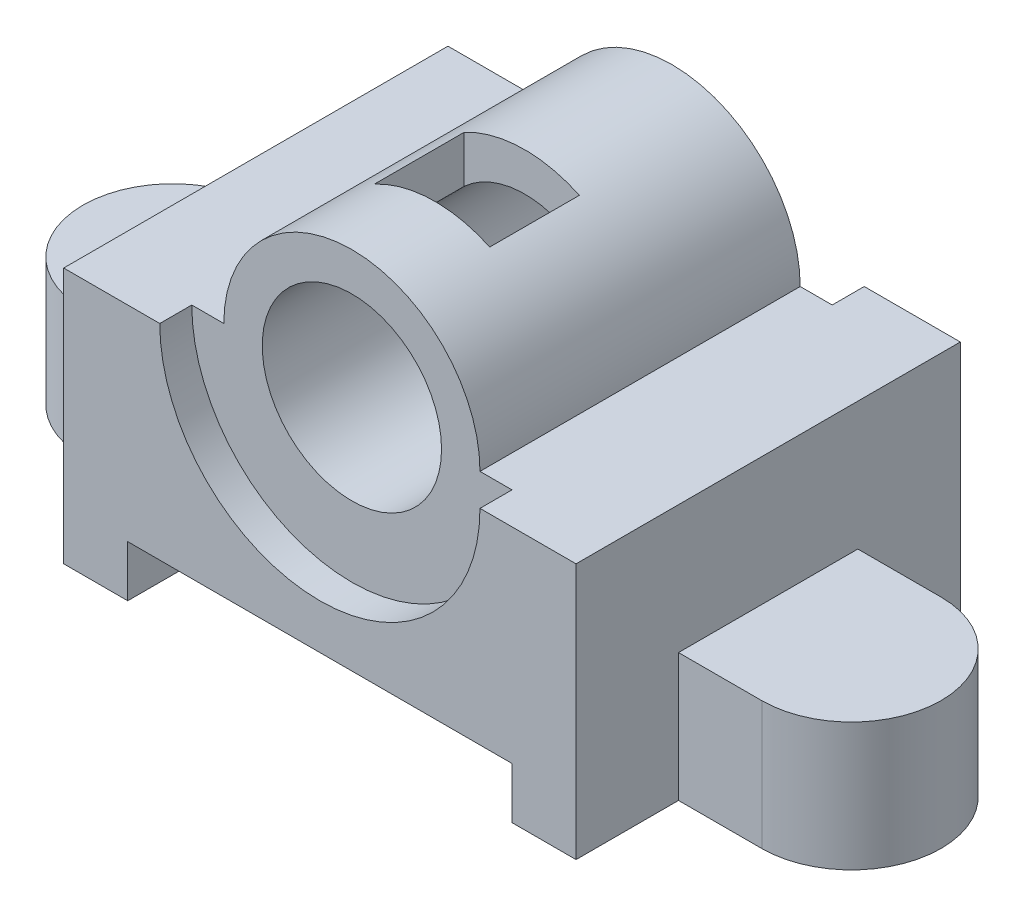
ISO-10303-21;
HEADER;
FILE_DESCRIPTION(('STEP AP214'),'2;1');
FILE_NAME('part.step','',(''),(''),'','','');
FILE_SCHEMA(('AUTOMOTIVE_DESIGN { 1 0 10303 214 1 1 1 1 }'));
ENDSEC;
DATA;
#1=APPLICATION_CONTEXT('core data for automotive mechanical design processes');
#2=APPLICATION_PROTOCOL_DEFINITION('international standard','automotive_design',2000,#1);
#3=PRODUCT_CONTEXT('',#1,'mechanical');
#4=PRODUCT('Part','Part','',(#3));
#5=PRODUCT_RELATED_PRODUCT_CATEGORY('part','',(#4));
#6=PRODUCT_DEFINITION_FORMATION('','',#4);
#7=PRODUCT_DEFINITION_CONTEXT('part definition',#1,'design');
#8=PRODUCT_DEFINITION('design','',#6,#7);
#9=PRODUCT_DEFINITION_SHAPE('','',#8);
#10=(LENGTH_UNIT() NAMED_UNIT(*) SI_UNIT(.MILLI.,.METRE.));
#11=(NAMED_UNIT(*) PLANE_ANGLE_UNIT() SI_UNIT($,.RADIAN.));
#12=(NAMED_UNIT(*) SI_UNIT($,.STERADIAN.) SOLID_ANGLE_UNIT());
#13=UNCERTAINTY_MEASURE_WITH_UNIT(LENGTH_MEASURE(1.E-05),#10,'distance_accuracy_value','');
#14=(GEOMETRIC_REPRESENTATION_CONTEXT(3) GLOBAL_UNCERTAINTY_ASSIGNED_CONTEXT((#13)) GLOBAL_UNIT_ASSIGNED_CONTEXT((#10,
#11,#12)) REPRESENTATION_CONTEXT('',''));
#15=CARTESIAN_POINT('',(0.,0.,0.));
#16=DIRECTION('',(0.,0.,1.));
#17=DIRECTION('',(1.,0.,0.));
#18=AXIS2_PLACEMENT_3D('',#15,#16,#17);
#19=CARTESIAN_POINT('',(37.2643253234751,0.,-60.));
#20=DIRECTION('',(1.,0.,0.));
#21=DIRECTION('',(0.,0.,-1.));
#22=AXIS2_PLACEMENT_3D('',#19,#20,#21);
#23=PLANE('',#22);
#24=DIRECTION('',(0.,-1.,0.));
#25=VECTOR('',#24,1.);
#26=CARTESIAN_POINT('',(37.264325323475,20.,-44.));
#27=LINE('',#26,#25);
#28=CARTESIAN_POINT('',(37.2643253234751,20.0000000000001,-44.));
#29=VERTEX_POINT('',#28);
#30=CARTESIAN_POINT('',(37.2643253234751,0.,-44.));
#31=VERTEX_POINT('',#30);
#32=EDGE_CURVE('E210',#29,#31,#27,.T.);
#33=ORIENTED_EDGE('',*,*,#32,.T.);
#34=DIRECTION('',(0.,0.,1.));
#35=VECTOR('',#34,1.);
#36=CARTESIAN_POINT('',(37.2643253234751,0.,-60.));
#37=LINE('',#36,#35);
#38=CARTESIAN_POINT('',(37.2643253234751,0.,-60.));
#39=VERTEX_POINT('',#38);
#40=EDGE_CURVE('E214',#39,#31,#37,.T.);
#41=ORIENTED_EDGE('',*,*,#40,.F.);
#42=DIRECTION('',(0.,1.,0.));
#43=VECTOR('',#42,1.);
#44=CARTESIAN_POINT('',(37.2643253234751,0.,-60.));
#45=LINE('',#44,#43);
#46=CARTESIAN_POINT('',(37.2643253234751,40.,-60.));
#47=VERTEX_POINT('',#46);
#48=EDGE_CURVE('E371',#39,#47,#45,.T.);
#49=ORIENTED_EDGE('',*,*,#48,.T.);
#50=DIRECTION('',(0.,0.,1.));
#51=VECTOR('',#50,1.);
#52=CARTESIAN_POINT('',(37.2643253234751,40.,-60.));
#53=LINE('',#52,#51);
#54=CARTESIAN_POINT('',(37.2643253234751,40.,0.));
#55=VERTEX_POINT('',#54);
#56=EDGE_CURVE('E234',#47,#55,#53,.T.);
#57=ORIENTED_EDGE('',*,*,#56,.T.);
#58=DIRECTION('',(0.,1.,0.));
#59=VECTOR('',#58,1.);
#60=CARTESIAN_POINT('',(37.2643253234751,0.,0.));
#61=LINE('',#60,#59);
#62=CARTESIAN_POINT('',(37.2643253234751,0.,0.));
#63=VERTEX_POINT('',#62);
#64=EDGE_CURVE('E383',#63,#55,#61,.T.);
#65=ORIENTED_EDGE('',*,*,#64,.F.);
#66=CARTESIAN_POINT('',(37.2643253234751,0.,-16.));
#67=VERTEX_POINT('',#66);
#68=EDGE_CURVE('E235',#67,#63,#37,.T.);
#69=ORIENTED_EDGE('',*,*,#68,.F.);
#70=DIRECTION('',(0.,-1.,0.));
#71=VECTOR('',#70,1.);
#72=CARTESIAN_POINT('',(37.264325323475,20.,-16.));
#73=LINE('',#72,#71);
#74=CARTESIAN_POINT('',(37.2643253234751,20.0000000000001,-16.));
#75=VERTEX_POINT('',#74);
#76=EDGE_CURVE('E54',#75,#67,#73,.T.);
#77=ORIENTED_EDGE('',*,*,#76,.F.);
#78=DIRECTION('',(0.,0.,1.));
#79=VECTOR('',#78,1.);
#80=CARTESIAN_POINT('',(37.264325323475,20.,0.));
#81=LINE('',#80,#79);
#82=EDGE_CURVE('E59',#29,#75,#81,.T.);
#83=ORIENTED_EDGE('',*,*,#82,.F.);
#84=EDGE_LOOP('',(#33,#41,#49,#57,#65,#69,#77,#83));
#85=FACE_BOUND('',#84,.T.);
#86=ADVANCED_FACE('F39',(#85),#23,.T.);
#87=CARTESIAN_POINT('',(-42.735674676525,40.,-60.));
#88=DIRECTION('',(-1.,0.,0.));
#89=DIRECTION('',(0.,-1.,0.));
#90=AXIS2_PLACEMENT_3D('',#87,#88,#89);
#91=PLANE('',#90);
#92=DIRECTION('',(0.,-1.,0.));
#93=VECTOR('',#92,1.);
#94=CARTESIAN_POINT('',(-42.735674676525,20.,-16.));
#95=LINE('',#94,#93);
#96=CARTESIAN_POINT('',(-42.735674676525,20.,-16.));
#97=VERTEX_POINT('',#96);
#98=CARTESIAN_POINT('',(-42.735674676525,0.,-16.));
#99=VERTEX_POINT('',#98);
#100=EDGE_CURVE('E294',#97,#99,#95,.T.);
#101=ORIENTED_EDGE('',*,*,#100,.T.);
#102=DIRECTION('',(0.,0.,1.));
#103=VECTOR('',#102,1.);
#104=CARTESIAN_POINT('',(-42.735674676525,0.,-60.));
#105=LINE('',#104,#103);
#106=CARTESIAN_POINT('',(-42.735674676525,0.,0.));
#107=VERTEX_POINT('',#106);
#108=EDGE_CURVE('E244',#99,#107,#105,.T.);
#109=ORIENTED_EDGE('',*,*,#108,.T.);
#110=DIRECTION('',(0.,-1.,0.));
#111=VECTOR('',#110,1.);
#112=CARTESIAN_POINT('',(-42.735674676525,40.,0.));
#113=LINE('',#112,#111);
#114=CARTESIAN_POINT('',(-42.735674676525,40.,0.));
#115=VERTEX_POINT('',#114);
#116=EDGE_CURVE('E358',#115,#107,#113,.T.);
#117=ORIENTED_EDGE('',*,*,#116,.F.);
#118=DIRECTION('',(0.,0.,1.));
#119=VECTOR('',#118,1.);
#120=CARTESIAN_POINT('',(-42.735674676525,40.,-60.));
#121=LINE('',#120,#119);
#122=CARTESIAN_POINT('',(-42.735674676525,40.,-60.));
#123=VERTEX_POINT('',#122);
#124=EDGE_CURVE('E237',#123,#115,#121,.T.);
#125=ORIENTED_EDGE('',*,*,#124,.F.);
#126=DIRECTION('',(0.,-1.,0.));
#127=VECTOR('',#126,1.);
#128=CARTESIAN_POINT('',(-42.735674676525,40.,-60.));
#129=LINE('',#128,#127);
#130=CARTESIAN_POINT('',(-42.735674676525,0.,-60.));
#131=VERTEX_POINT('',#130);
#132=EDGE_CURVE('E364',#123,#131,#129,.T.);
#133=ORIENTED_EDGE('',*,*,#132,.T.);
#134=CARTESIAN_POINT('',(-42.735674676525,0.,-44.));
#135=VERTEX_POINT('',#134);
#136=EDGE_CURVE('E239',#131,#135,#105,.T.);
#137=ORIENTED_EDGE('',*,*,#136,.T.);
#138=DIRECTION('',(0.,-1.,0.));
#139=VECTOR('',#138,1.);
#140=CARTESIAN_POINT('',(-42.735674676525,20.,-44.));
#141=LINE('',#140,#139);
#142=CARTESIAN_POINT('',(-42.735674676525,20.,-44.));
#143=VERTEX_POINT('',#142);
#144=EDGE_CURVE('E453',#143,#135,#141,.T.);
#145=ORIENTED_EDGE('',*,*,#144,.F.);
#146=DIRECTION('',(0.,0.,-1.));
#147=VECTOR('',#146,1.);
#148=CARTESIAN_POINT('',(-42.735674676525,20.,0.));
#149=LINE('',#148,#147);
#150=EDGE_CURVE('E454',#97,#143,#149,.T.);
#151=ORIENTED_EDGE('',*,*,#150,.F.);
#152=EDGE_LOOP('',(#101,#109,#117,#125,#133,#137,#145,#151));
#153=FACE_BOUND('',#152,.T.);
#154=ADVANCED_FACE('F41',(#153),#91,.T.);
#155=CARTESIAN_POINT('',(-2.73567467652495,40.,-55.));
#156=DIRECTION('',(0.,0.,1.));
#157=DIRECTION('',(1.,0.,0.));
#158=AXIS2_PLACEMENT_3D('',#155,#156,#157);
#159=CYLINDRICAL_SURFACE('',#158,20.);
#160=CARTESIAN_POINT('',(-2.73567467652495,40.,-55.));
#161=DIRECTION('',(0.,0.,1.));
#162=DIRECTION('',(1.,0.,0.));
#163=AXIS2_PLACEMENT_3D('',#160,#161,#162);
#164=CIRCLE('',#163,20.);
#165=CARTESIAN_POINT('',(17.264325323475,40.,-55.));
#166=VERTEX_POINT('',#165);
#167=CARTESIAN_POINT('',(-22.735674676525,40.,-55.));
#168=VERTEX_POINT('',#167);
#169=EDGE_CURVE('E310',#166,#168,#164,.T.);
#170=ORIENTED_EDGE('',*,*,#169,.T.);
#171=DIRECTION('',(0.,0.,1.));
#172=VECTOR('',#171,1.);
#173=CARTESIAN_POINT('',(-22.735674676525,40.,-55.));
#174=LINE('',#173,#172);
#175=CARTESIAN_POINT('',(-22.735674676525,40.,-5.));
#176=VERTEX_POINT('',#175);
#177=EDGE_CURVE('E318',#168,#176,#174,.T.);
#178=ORIENTED_EDGE('',*,*,#177,.T.);
#179=CARTESIAN_POINT('',(-2.73567467652495,40.,-5.));
#180=DIRECTION('',(0.,0.,1.));
#181=DIRECTION('',(1.,0.,0.));
#182=AXIS2_PLACEMENT_3D('',#179,#180,#181);
#183=CIRCLE('',#182,20.);
#184=CARTESIAN_POINT('',(17.264325323475,40.,-5.));
#185=VERTEX_POINT('',#184);
#186=EDGE_CURVE('E307',#185,#176,#183,.T.);
#187=ORIENTED_EDGE('',*,*,#186,.F.);
#188=DIRECTION('',(0.,0.,1.));
#189=VECTOR('',#188,1.);
#190=CARTESIAN_POINT('',(17.264325323475,40.,-55.));
#191=LINE('',#190,#189);
#192=EDGE_CURVE('E313',#185,#166,#191,.F.);
#193=ORIENTED_EDGE('',*,*,#192,.T.);
#194=EDGE_LOOP('',(#170,#178,#187,#193));
#195=FACE_BOUND('',#194,.T.);
#196=CARTESIAN_POINT('',(-2.73567467652495,40.,-18.));
#197=DIRECTION('',(0.,0.,-1.));
#198=DIRECTION('',(-1.,0.,0.));
#199=AXIS2_PLACEMENT_3D('',#196,#197,#198);
#200=CIRCLE('',#199,20.);
#201=CARTESIAN_POINT('',(5.78508231148436,58.094106785119,-18.));
#202=VERTEX_POINT('',#201);
#203=CARTESIAN_POINT('',(-12.2138200901533,57.6114950960478,-18.));
#204=VERTEX_POINT('',#203);
#205=EDGE_CURVE('E300',#202,#204,#200,.F.);
#206=ORIENTED_EDGE('',*,*,#205,.T.);
#207=DIRECTION('',(0.,0.,1.));
#208=VECTOR('',#207,1.);
#209=CARTESIAN_POINT('',(-12.2138200901533,57.6114950960478,-55.));
#210=LINE('',#209,#208);
#211=CARTESIAN_POINT('',(-12.2138200901533,57.6114950960478,-32.));
#212=VERTEX_POINT('',#211);
#213=EDGE_CURVE('E277',#204,#212,#210,.F.);
#214=ORIENTED_EDGE('',*,*,#213,.T.);
#215=CARTESIAN_POINT('',(-2.73567467652495,40.,-32.));
#216=DIRECTION('',(0.,0.,1.));
#217=DIRECTION('',(1.,0.,0.));
#218=AXIS2_PLACEMENT_3D('',#215,#216,#217);
#219=CIRCLE('',#218,20.);
#220=CARTESIAN_POINT('',(5.78508231148436,58.094106785119,-32.));
#221=VERTEX_POINT('',#220);
#222=EDGE_CURVE('E278',#212,#221,#219,.F.);
#223=ORIENTED_EDGE('',*,*,#222,.T.);
#224=DIRECTION('',(0.,0.,1.));
#225=VECTOR('',#224,1.);
#226=CARTESIAN_POINT('',(5.78508231148436,58.094106785119,-55.));
#227=LINE('',#226,#225);
#228=EDGE_CURVE('E290',#221,#202,#227,.T.);
#229=ORIENTED_EDGE('',*,*,#228,.T.);
#230=EDGE_LOOP('',(#206,#214,#223,#229));
#231=FACE_BOUND('',#230,.T.);
#232=ADVANCED_FACE('F418',(#195,#231),#159,.T.);
#233=CARTESIAN_POINT('',(-2.73567467652495,40.,-55.));
#234=DIRECTION('',(0.,0.,1.));
#235=DIRECTION('',(1.,0.,0.));
#236=AXIS2_PLACEMENT_3D('',#233,#234,#235);
#237=CYLINDRICAL_SURFACE('',#236,14.);
#238=CARTESIAN_POINT('',(-2.73567467652495,40.,-5.));
#239=DIRECTION('',(0.,0.,1.));
#240=DIRECTION('',(1.,0.,0.));
#241=AXIS2_PLACEMENT_3D('',#238,#239,#240);
#242=CIRCLE('',#241,14.);
#243=CARTESIAN_POINT('',(11.264325323475,40.,-5.));
#244=VERTEX_POINT('',#243);
#245=EDGE_CURVE('E303',#244,#244,#242,.T.);
#246=ORIENTED_EDGE('',*,*,#245,.T.);
#247=EDGE_LOOP('',(#246));
#248=FACE_BOUND('',#247,.T.);
#249=CARTESIAN_POINT('',(-2.73567467652495,40.,-55.));
#250=DIRECTION('',(0.,0.,1.));
#251=DIRECTION('',(1.,0.,0.));
#252=AXIS2_PLACEMENT_3D('',#249,#250,#251);
#253=CIRCLE('',#252,14.);
#254=CARTESIAN_POINT('',(11.264325323475,40.,-55.));
#255=VERTEX_POINT('',#254);
#256=EDGE_CURVE('E304',#255,#255,#253,.T.);
#257=ORIENTED_EDGE('',*,*,#256,.F.);
#258=EDGE_LOOP('',(#257));
#259=FACE_BOUND('',#258,.T.);
#260=DIRECTION('',(0.,0.,1.));
#261=VECTOR('',#260,1.);
#262=CARTESIAN_POINT('',(-12.2138200901533,50.3036284637071,-55.));
#263=LINE('',#262,#261);
#264=CARTESIAN_POINT('',(-12.2138200901533,50.3036284637071,-18.));
#265=VERTEX_POINT('',#264);
#266=CARTESIAN_POINT('',(-12.2138200901533,50.3036284637071,-32.));
#267=VERTEX_POINT('',#266);
#268=EDGE_CURVE('E11',#265,#267,#263,.F.);
#269=ORIENTED_EDGE('',*,*,#268,.F.);
#270=CARTESIAN_POINT('',(-2.73567467652495,40.,-18.));
#271=DIRECTION('',(0.,0.,-1.));
#272=DIRECTION('',(-1.,0.,0.));
#273=AXIS2_PLACEMENT_3D('',#270,#271,#272);
#274=CIRCLE('',#273,14.);
#275=CARTESIAN_POINT('',(5.78508231148436,51.1084067422511,-18.));
#276=VERTEX_POINT('',#275);
#277=EDGE_CURVE('E47',#276,#265,#274,.F.);
#278=ORIENTED_EDGE('',*,*,#277,.F.);
#279=DIRECTION('',(0.,0.,1.));
#280=VECTOR('',#279,1.);
#281=CARTESIAN_POINT('',(5.78508231148436,51.1084067422511,-55.));
#282=LINE('',#281,#280);
#283=CARTESIAN_POINT('',(5.78508231148436,51.1084067422511,-32.));
#284=VERTEX_POINT('',#283);
#285=EDGE_CURVE('E258',#284,#276,#282,.T.);
#286=ORIENTED_EDGE('',*,*,#285,.F.);
#287=CARTESIAN_POINT('',(-2.73567467652495,40.,-32.));
#288=DIRECTION('',(0.,0.,1.));
#289=DIRECTION('',(1.,0.,0.));
#290=AXIS2_PLACEMENT_3D('',#287,#288,#289);
#291=CIRCLE('',#290,14.);
#292=EDGE_CURVE('E256',#267,#284,#291,.F.);
#293=ORIENTED_EDGE('',*,*,#292,.F.);
#294=EDGE_LOOP('',(#269,#278,#286,#293));
#295=FACE_BOUND('',#294,.T.);
#296=ADVANCED_FACE('F280',(#248,#259,#295),#237,.F.);
#297=CARTESIAN_POINT('',(37.2643253234751,40.,-60.));
#298=DIRECTION('',(0.,1.,0.));
#299=DIRECTION('',(-1.,0.,0.));
#300=AXIS2_PLACEMENT_3D('',#297,#298,#299);
#301=PLANE('',#300);
#302=ORIENTED_EDGE('',*,*,#177,.F.);
#303=DIRECTION('',(-1.,0.,0.));
#304=VECTOR('',#303,1.);
#305=CARTESIAN_POINT('',(37.2643253234751,40.,-55.));
#306=LINE('',#305,#304);
#307=CARTESIAN_POINT('',(-27.735674676525,40.,-55.));
#308=VERTEX_POINT('',#307);
#309=EDGE_CURVE('E253',#168,#308,#306,.T.);
#310=ORIENTED_EDGE('',*,*,#309,.T.);
#311=DIRECTION('',(0.,0.,-1.));
#312=VECTOR('',#311,1.);
#313=CARTESIAN_POINT('',(-27.735674676525,40.,-55.));
#314=LINE('',#313,#312);
#315=CARTESIAN_POINT('',(-27.735674676525,40.,-60.));
#316=VERTEX_POINT('',#315);
#317=EDGE_CURVE('E324',#316,#308,#314,.F.);
#318=ORIENTED_EDGE('',*,*,#317,.F.);
#319=DIRECTION('',(-1.,0.,0.));
#320=VECTOR('',#319,1.);
#321=CARTESIAN_POINT('',(37.2643253234751,40.,-60.));
#322=LINE('',#321,#320);
#323=EDGE_CURVE('E373',#316,#123,#322,.T.);
#324=ORIENTED_EDGE('',*,*,#323,.T.);
#325=ORIENTED_EDGE('',*,*,#124,.T.);
#326=DIRECTION('',(-1.,0.,0.));
#327=VECTOR('',#326,1.);
#328=CARTESIAN_POINT('',(37.2643253234751,40.,0.));
#329=LINE('',#328,#327);
#330=CARTESIAN_POINT('',(-27.735674676525,40.,0.));
#331=VERTEX_POINT('',#330);
#332=EDGE_CURVE('E386',#331,#115,#329,.T.);
#333=ORIENTED_EDGE('',*,*,#332,.F.);
#334=DIRECTION('',(0.,0.,1.));
#335=VECTOR('',#334,1.);
#336=CARTESIAN_POINT('',(-27.735674676525,40.,-5.));
#337=LINE('',#336,#335);
#338=CARTESIAN_POINT('',(-27.735674676525,40.,-5.));
#339=VERTEX_POINT('',#338);
#340=EDGE_CURVE('E335',#339,#331,#337,.T.);
#341=ORIENTED_EDGE('',*,*,#340,.F.);
#342=DIRECTION('',(1.,0.,0.));
#343=VECTOR('',#342,1.);
#344=CARTESIAN_POINT('',(37.2643253234751,40.,-5.));
#345=LINE('',#344,#343);
#346=EDGE_CURVE('E248',#339,#176,#345,.T.);
#347=ORIENTED_EDGE('',*,*,#346,.T.);
#348=EDGE_LOOP('',(#302,#310,#318,#324,#325,#333,#341,#347));
#349=FACE_BOUND('',#348,.T.);
#350=ADVANCED_FACE('F393',(#349),#301,.T.);
#351=CARTESIAN_POINT('',(-42.735674676525,0.,-60.));
#352=DIRECTION('',(0.,-1.,0.));
#353=DIRECTION('',(0.,0.,-1.));
#354=AXIS2_PLACEMENT_3D('',#351,#352,#353);
#355=PLANE('',#354);
#356=DIRECTION('',(0.,0.,1.));
#357=VECTOR('',#356,1.);
#358=CARTESIAN_POINT('',(-32.735674676525,0.,-60.));
#359=LINE('',#358,#357);
#360=CARTESIAN_POINT('',(-32.735674676525,0.,-60.));
#361=VERTEX_POINT('',#360);
#362=CARTESIAN_POINT('',(-32.735674676525,0.,0.));
#363=VERTEX_POINT('',#362);
#364=EDGE_CURVE('E355',#361,#363,#359,.T.);
#365=ORIENTED_EDGE('',*,*,#364,.T.);
#366=DIRECTION('',(1.,0.,0.));
#367=VECTOR('',#366,1.);
#368=CARTESIAN_POINT('',(-42.735674676525,0.,0.));
#369=LINE('',#368,#367);
#370=EDGE_CURVE('E380',#107,#363,#369,.T.);
#371=ORIENTED_EDGE('',*,*,#370,.F.);
#372=ORIENTED_EDGE('',*,*,#108,.F.);
#373=DIRECTION('',(1.,0.,0.));
#374=VECTOR('',#373,1.);
#375=CARTESIAN_POINT('',(0.,0.,-16.));
#376=LINE('',#375,#374);
#377=CARTESIAN_POINT('',(-55.735674676525,0.,-16.));
#378=VERTEX_POINT('',#377);
#379=EDGE_CURVE('E490',#378,#99,#376,.T.);
#380=ORIENTED_EDGE('',*,*,#379,.F.);
#381=CARTESIAN_POINT('',(-55.735674676525,0.,-30.));
#382=DIRECTION('',(0.,-1.,0.));
#383=DIRECTION('',(1.,0.,0.));
#384=AXIS2_PLACEMENT_3D('',#381,#382,#383);
#385=CIRCLE('',#384,14.);
#386=CARTESIAN_POINT('',(-55.735674676525,0.,-44.));
#387=VERTEX_POINT('',#386);
#388=EDGE_CURVE('E487',#387,#378,#385,.F.);
#389=ORIENTED_EDGE('',*,*,#388,.F.);
#390=DIRECTION('',(-1.,0.,0.));
#391=VECTOR('',#390,1.);
#392=CARTESIAN_POINT('',(0.,0.,-44.));
#393=LINE('',#392,#391);
#394=EDGE_CURVE('E450',#135,#387,#393,.T.);
#395=ORIENTED_EDGE('',*,*,#394,.F.);
#396=ORIENTED_EDGE('',*,*,#136,.F.);
#397=DIRECTION('',(1.,0.,0.));
#398=VECTOR('',#397,1.);
#399=CARTESIAN_POINT('',(-42.735674676525,0.,-60.));
#400=LINE('',#399,#398);
#401=EDGE_CURVE('E368',#131,#361,#400,.T.);
#402=ORIENTED_EDGE('',*,*,#401,.T.);
#403=EDGE_LOOP('',(#365,#371,#372,#380,#389,#395,#396,#402));
#404=FACE_BOUND('',#403,.T.);
#405=ADVANCED_FACE('F446',(#404),#355,.T.);
#406=ORIENTED_EDGE('',*,*,#192,.F.);
#407=CARTESIAN_POINT('',(22.264325323475,40.,-5.));
#408=VERTEX_POINT('',#407);
#409=EDGE_CURVE('E247',#185,#408,#345,.T.);
#410=ORIENTED_EDGE('',*,*,#409,.T.);
#411=DIRECTION('',(0.,0.,1.));
#412=VECTOR('',#411,1.);
#413=CARTESIAN_POINT('',(22.264325323475,40.,-5.));
#414=LINE('',#413,#412);
#415=CARTESIAN_POINT('',(22.264325323475,40.,0.));
#416=VERTEX_POINT('',#415);
#417=EDGE_CURVE('E332',#416,#408,#414,.F.);
#418=ORIENTED_EDGE('',*,*,#417,.F.);
#419=EDGE_CURVE('E367',#55,#416,#329,.T.);
#420=ORIENTED_EDGE('',*,*,#419,.F.);
#421=ORIENTED_EDGE('',*,*,#56,.F.);
#422=CARTESIAN_POINT('',(22.264325323475,40.,-60.));
#423=VERTEX_POINT('',#422);
#424=EDGE_CURVE('E374',#47,#423,#322,.T.);
#425=ORIENTED_EDGE('',*,*,#424,.T.);
#426=DIRECTION('',(0.,0.,-1.));
#427=VECTOR('',#426,1.);
#428=CARTESIAN_POINT('',(22.264325323475,40.,-55.));
#429=LINE('',#428,#427);
#430=CARTESIAN_POINT('',(22.264325323475,40.,-55.));
#431=VERTEX_POINT('',#430);
#432=EDGE_CURVE('E327',#431,#423,#429,.T.);
#433=ORIENTED_EDGE('',*,*,#432,.F.);
#434=EDGE_CURVE('E254',#431,#166,#306,.T.);
#435=ORIENTED_EDGE('',*,*,#434,.T.);
#436=EDGE_LOOP('',(#406,#410,#418,#420,#421,#425,#433,#435));
#437=FACE_BOUND('',#436,.T.);
#438=ADVANCED_FACE('F412',(#437),#301,.T.);
#439=DIRECTION('',(0.,0.,1.));
#440=VECTOR('',#439,1.);
#441=CARTESIAN_POINT('',(27.2643253234751,0.,-60.));
#442=LINE('',#441,#440);
#443=CARTESIAN_POINT('',(27.2643253234751,0.,-60.));
#444=VERTEX_POINT('',#443);
#445=CARTESIAN_POINT('',(27.2643253234751,0.,0.));
#446=VERTEX_POINT('',#445);
#447=EDGE_CURVE('E348',#444,#446,#442,.T.);
#448=ORIENTED_EDGE('',*,*,#447,.F.);
#449=EDGE_CURVE('E233',#444,#39,#400,.T.);
#450=ORIENTED_EDGE('',*,*,#449,.T.);
#451=ORIENTED_EDGE('',*,*,#40,.T.);
#452=DIRECTION('',(-1.,0.,0.));
#453=VECTOR('',#452,1.);
#454=CARTESIAN_POINT('',(0.,0.,-44.));
#455=LINE('',#454,#453);
#456=CARTESIAN_POINT('',(50.264325323475,0.,-44.));
#457=VERTEX_POINT('',#456);
#458=EDGE_CURVE('E222',#457,#31,#455,.T.);
#459=ORIENTED_EDGE('',*,*,#458,.F.);
#460=CARTESIAN_POINT('',(50.264325323475,0.,-30.));
#461=DIRECTION('',(0.,-1.,0.));
#462=DIRECTION('',(1.,0.,0.));
#463=AXIS2_PLACEMENT_3D('',#460,#461,#462);
#464=CIRCLE('',#463,14.);
#465=CARTESIAN_POINT('',(50.264325323475,0.,-16.));
#466=VERTEX_POINT('',#465);
#467=EDGE_CURVE('E228',#466,#457,#464,.F.);
#468=ORIENTED_EDGE('',*,*,#467,.F.);
#469=DIRECTION('',(1.,0.,0.));
#470=VECTOR('',#469,1.);
#471=CARTESIAN_POINT('',(0.,0.,-16.));
#472=LINE('',#471,#470);
#473=EDGE_CURVE('E492',#67,#466,#472,.T.);
#474=ORIENTED_EDGE('',*,*,#473,.F.);
#475=ORIENTED_EDGE('',*,*,#68,.T.);
#476=EDGE_CURVE('E379',#446,#63,#369,.T.);
#477=ORIENTED_EDGE('',*,*,#476,.F.);
#478=EDGE_LOOP('',(#448,#450,#451,#459,#468,#474,#475,#477));
#479=FACE_BOUND('',#478,.T.);
#480=ADVANCED_FACE('F231',(#479),#355,.T.);
#481=CARTESIAN_POINT('',(0.,0.,-60.));
#482=DIRECTION('',(0.,0.,1.));
#483=DIRECTION('',(1.,0.,0.));
#484=AXIS2_PLACEMENT_3D('',#481,#482,#483);
#485=PLANE('',#484);
#486=ORIENTED_EDGE('',*,*,#323,.F.);
#487=CARTESIAN_POINT('',(-2.73567467652495,40.,-60.));
#488=DIRECTION('',(0.,0.,1.));
#489=DIRECTION('',(1.,0.,0.));
#490=AXIS2_PLACEMENT_3D('',#487,#488,#489);
#491=CIRCLE('',#490,25.);
#492=EDGE_CURVE('E250',#316,#423,#491,.T.);
#493=ORIENTED_EDGE('',*,*,#492,.T.);
#494=ORIENTED_EDGE('',*,*,#424,.F.);
#495=ORIENTED_EDGE('',*,*,#48,.F.);
#496=ORIENTED_EDGE('',*,*,#449,.F.);
#497=DIRECTION('',(0.,1.,0.));
#498=VECTOR('',#497,1.);
#499=CARTESIAN_POINT('',(27.2643253234751,8.00000000000004,-60.));
#500=LINE('',#499,#498);
#501=CARTESIAN_POINT('',(27.2643253234751,8.00000000000004,-60.));
#502=VERTEX_POINT('',#501);
#503=EDGE_CURVE('E338',#444,#502,#500,.T.);
#504=ORIENTED_EDGE('',*,*,#503,.T.);
#505=DIRECTION('',(-1.,0.,0.));
#506=VECTOR('',#505,1.);
#507=CARTESIAN_POINT('',(-32.735674676525,8.,-60.));
#508=LINE('',#507,#506);
#509=CARTESIAN_POINT('',(-32.735674676525,8.,-60.));
#510=VERTEX_POINT('',#509);
#511=EDGE_CURVE('E341',#502,#510,#508,.T.);
#512=ORIENTED_EDGE('',*,*,#511,.T.);
#513=DIRECTION('',(0.,-1.,0.));
#514=VECTOR('',#513,1.);
#515=CARTESIAN_POINT('',(-32.735674676525,0.,-60.));
#516=LINE('',#515,#514);
#517=EDGE_CURVE('E345',#510,#361,#516,.T.);
#518=ORIENTED_EDGE('',*,*,#517,.T.);
#519=ORIENTED_EDGE('',*,*,#401,.F.);
#520=ORIENTED_EDGE('',*,*,#132,.F.);
#521=EDGE_LOOP('',(#486,#493,#494,#495,#496,#504,#512,#518,#519,#520));
#522=FACE_BOUND('',#521,.T.);
#523=ADVANCED_FACE('F429',(#522),#485,.F.);
#524=CARTESIAN_POINT('',(0.,0.,0.));
#525=DIRECTION('',(0.,0.,1.));
#526=DIRECTION('',(1.,0.,0.));
#527=AXIS2_PLACEMENT_3D('',#524,#525,#526);
#528=PLANE('',#527);
#529=CARTESIAN_POINT('',(-2.73567467652495,40.,0.));
#530=DIRECTION('',(0.,0.,1.));
#531=DIRECTION('',(1.,0.,0.));
#532=AXIS2_PLACEMENT_3D('',#529,#530,#531);
#533=CIRCLE('',#532,25.);
#534=EDGE_CURVE('E245',#331,#416,#533,.T.);
#535=ORIENTED_EDGE('',*,*,#534,.F.);
#536=ORIENTED_EDGE('',*,*,#332,.T.);
#537=ORIENTED_EDGE('',*,*,#116,.T.);
#538=ORIENTED_EDGE('',*,*,#370,.T.);
#539=DIRECTION('',(0.,-1.,0.));
#540=VECTOR('',#539,1.);
#541=CARTESIAN_POINT('',(-32.735674676525,0.,0.));
#542=LINE('',#541,#540);
#543=CARTESIAN_POINT('',(-32.735674676525,8.,0.));
#544=VERTEX_POINT('',#543);
#545=EDGE_CURVE('E342',#544,#363,#542,.T.);
#546=ORIENTED_EDGE('',*,*,#545,.F.);
#547=DIRECTION('',(-1.,0.,0.));
#548=VECTOR('',#547,1.);
#549=CARTESIAN_POINT('',(-32.735674676525,8.,0.));
#550=LINE('',#549,#548);
#551=CARTESIAN_POINT('',(27.2643253234751,8.00000000000004,0.));
#552=VERTEX_POINT('',#551);
#553=EDGE_CURVE('E351',#552,#544,#550,.T.);
#554=ORIENTED_EDGE('',*,*,#553,.F.);
#555=DIRECTION('',(0.,1.,0.));
#556=VECTOR('',#555,1.);
#557=CARTESIAN_POINT('',(27.2643253234751,8.00000000000004,0.));
#558=LINE('',#557,#556);
#559=EDGE_CURVE('E337',#446,#552,#558,.T.);
#560=ORIENTED_EDGE('',*,*,#559,.F.);
#561=ORIENTED_EDGE('',*,*,#476,.T.);
#562=ORIENTED_EDGE('',*,*,#64,.T.);
#563=ORIENTED_EDGE('',*,*,#419,.T.);
#564=EDGE_LOOP('',(#535,#536,#537,#538,#546,#554,#560,#561,#562,#563));
#565=FACE_BOUND('',#564,.T.);
#566=ADVANCED_FACE('F403',(#565),#528,.T.);
#567=CARTESIAN_POINT('',(-32.735674676525,0.,-60.));
#568=DIRECTION('',(-1.,0.,0.));
#569=DIRECTION('',(0.,0.,1.));
#570=AXIS2_PLACEMENT_3D('',#567,#568,#569);
#571=PLANE('',#570);
#572=ORIENTED_EDGE('',*,*,#545,.T.);
#573=ORIENTED_EDGE('',*,*,#364,.F.);
#574=ORIENTED_EDGE('',*,*,#517,.F.);
#575=DIRECTION('',(0.,0.,1.));
#576=VECTOR('',#575,1.);
#577=CARTESIAN_POINT('',(-32.735674676525,8.,-60.));
#578=LINE('',#577,#576);
#579=EDGE_CURVE('E359',#510,#544,#578,.T.);
#580=ORIENTED_EDGE('',*,*,#579,.T.);
#581=EDGE_LOOP('',(#572,#573,#574,#580));
#582=FACE_BOUND('',#581,.T.);
#583=ADVANCED_FACE('F443',(#582),#571,.F.);
#584=CARTESIAN_POINT('',(-32.735674676525,8.,-60.));
#585=DIRECTION('',(0.,1.,0.));
#586=DIRECTION('',(-1.,0.,0.));
#587=AXIS2_PLACEMENT_3D('',#584,#585,#586);
#588=PLANE('',#587);
#589=ORIENTED_EDGE('',*,*,#553,.T.);
#590=ORIENTED_EDGE('',*,*,#579,.F.);
#591=ORIENTED_EDGE('',*,*,#511,.F.);
#592=DIRECTION('',(0.,0.,1.));
#593=VECTOR('',#592,1.);
#594=CARTESIAN_POINT('',(27.2643253234751,8.00000000000004,-60.));
#595=LINE('',#594,#593);
#596=EDGE_CURVE('E361',#502,#552,#595,.T.);
#597=ORIENTED_EDGE('',*,*,#596,.T.);
#598=EDGE_LOOP('',(#589,#590,#591,#597));
#599=FACE_BOUND('',#598,.T.);
#600=ADVANCED_FACE('F440',(#599),#588,.F.);
#601=CARTESIAN_POINT('',(27.2643253234751,8.00000000000004,-60.));
#602=DIRECTION('',(1.,0.,0.));
#603=DIRECTION('',(0.,1.,0.));
#604=AXIS2_PLACEMENT_3D('',#601,#602,#603);
#605=PLANE('',#604);
#606=ORIENTED_EDGE('',*,*,#559,.T.);
#607=ORIENTED_EDGE('',*,*,#596,.F.);
#608=ORIENTED_EDGE('',*,*,#503,.F.);
#609=ORIENTED_EDGE('',*,*,#447,.T.);
#610=EDGE_LOOP('',(#606,#607,#608,#609));
#611=FACE_BOUND('',#610,.T.);
#612=ADVANCED_FACE('F433',(#611),#605,.F.);
#613=CARTESIAN_POINT('',(-2.73567467652495,40.,-5.));
#614=DIRECTION('',(0.,0.,1.));
#615=DIRECTION('',(1.,0.,0.));
#616=AXIS2_PLACEMENT_3D('',#613,#614,#615);
#617=CYLINDRICAL_SURFACE('',#616,25.);
#618=ORIENTED_EDGE('',*,*,#340,.T.);
#619=ORIENTED_EDGE('',*,*,#534,.T.);
#620=ORIENTED_EDGE('',*,*,#417,.T.);
#621=CARTESIAN_POINT('',(-2.73567467652495,40.,-5.));
#622=DIRECTION('',(0.,0.,1.));
#623=DIRECTION('',(1.,0.,0.));
#624=AXIS2_PLACEMENT_3D('',#621,#622,#623);
#625=CIRCLE('',#624,25.);
#626=EDGE_CURVE('E329',#339,#408,#625,.T.);
#627=ORIENTED_EDGE('',*,*,#626,.F.);
#628=EDGE_LOOP('',(#618,#619,#620,#627));
#629=FACE_BOUND('',#628,.T.);
#630=ADVANCED_FACE('F408',(#629),#617,.F.);
#631=CARTESIAN_POINT('',(-2.73567467652495,40.,-5.));
#632=DIRECTION('',(0.,0.,1.));
#633=DIRECTION('',(1.,0.,0.));
#634=AXIS2_PLACEMENT_3D('',#631,#632,#633);
#635=PLANE('',#634);
#636=ORIENTED_EDGE('',*,*,#245,.F.);
#637=EDGE_LOOP('',(#636));
#638=FACE_BOUND('',#637,.T.);
#639=ORIENTED_EDGE('',*,*,#409,.F.);
#640=ORIENTED_EDGE('',*,*,#186,.T.);
#641=ORIENTED_EDGE('',*,*,#346,.F.);
#642=ORIENTED_EDGE('',*,*,#626,.T.);
#643=EDGE_LOOP('',(#639,#640,#641,#642));
#644=FACE_BOUND('',#643,.T.);
#645=ADVANCED_FACE('F415',(#638,#644),#635,.T.);
#646=CARTESIAN_POINT('',(-2.73567467652495,40.,-55.));
#647=DIRECTION('',(0.,0.,-1.));
#648=DIRECTION('',(-1.,0.,0.));
#649=AXIS2_PLACEMENT_3D('',#646,#647,#648);
#650=CYLINDRICAL_SURFACE('',#649,25.);
#651=ORIENTED_EDGE('',*,*,#432,.T.);
#652=ORIENTED_EDGE('',*,*,#492,.F.);
#653=ORIENTED_EDGE('',*,*,#317,.T.);
#654=CARTESIAN_POINT('',(-2.73567467652495,40.,-55.));
#655=DIRECTION('',(0.,0.,-1.));
#656=DIRECTION('',(-1.,0.,0.));
#657=AXIS2_PLACEMENT_3D('',#654,#655,#656);
#658=CIRCLE('',#657,25.);
#659=EDGE_CURVE('E321',#431,#308,#658,.T.);
#660=ORIENTED_EDGE('',*,*,#659,.F.);
#661=EDGE_LOOP('',(#651,#652,#653,#660));
#662=FACE_BOUND('',#661,.T.);
#663=ADVANCED_FACE('F425',(#662),#650,.F.);
#664=CARTESIAN_POINT('',(-2.73567467652495,40.,-55.));
#665=DIRECTION('',(0.,0.,-1.));
#666=DIRECTION('',(-1.,0.,0.));
#667=AXIS2_PLACEMENT_3D('',#664,#665,#666);
#668=PLANE('',#667);
#669=ORIENTED_EDGE('',*,*,#256,.T.);
#670=EDGE_LOOP('',(#669));
#671=FACE_BOUND('',#670,.T.);
#672=ORIENTED_EDGE('',*,*,#309,.F.);
#673=ORIENTED_EDGE('',*,*,#169,.F.);
#674=ORIENTED_EDGE('',*,*,#434,.F.);
#675=ORIENTED_EDGE('',*,*,#659,.T.);
#676=EDGE_LOOP('',(#672,#673,#674,#675));
#677=FACE_BOUND('',#676,.T.);
#678=ADVANCED_FACE('F422',(#671,#677),#668,.T.);
#679=CARTESIAN_POINT('',(-12.2138200901533,90.,-18.));
#680=DIRECTION('',(1.,0.,0.));
#681=DIRECTION('',(0.,1.,0.));
#682=AXIS2_PLACEMENT_3D('',#679,#680,#681);
#683=PLANE('',#682);
#684=DIRECTION('',(0.,-1.,0.));
#685=VECTOR('',#684,1.);
#686=CARTESIAN_POINT('',(-12.2138200901533,90.,-18.));
#687=LINE('',#686,#685);
#688=EDGE_CURVE('E265',#204,#265,#687,.T.);
#689=ORIENTED_EDGE('',*,*,#688,.T.);
#690=ORIENTED_EDGE('',*,*,#268,.T.);
#691=DIRECTION('',(0.,-1.,0.));
#692=VECTOR('',#691,1.);
#693=CARTESIAN_POINT('',(-12.2138200901533,90.,-32.));
#694=LINE('',#693,#692);
#695=EDGE_CURVE('E286',#212,#267,#694,.T.);
#696=ORIENTED_EDGE('',*,*,#695,.F.);
#697=ORIENTED_EDGE('',*,*,#213,.F.);
#698=EDGE_LOOP('',(#689,#690,#696,#697));
#699=FACE_BOUND('',#698,.T.);
#700=ADVANCED_FACE('F273',(#699),#683,.T.);
#701=CARTESIAN_POINT('',(-12.2138200901533,90.,-18.));
#702=DIRECTION('',(0.,0.,-1.));
#703=DIRECTION('',(-1.,0.,0.));
#704=AXIS2_PLACEMENT_3D('',#701,#702,#703);
#705=PLANE('',#704);
#706=DIRECTION('',(0.,-1.,0.));
#707=VECTOR('',#706,1.);
#708=CARTESIAN_POINT('',(5.78508231148436,90.,-18.));
#709=LINE('',#708,#707);
#710=EDGE_CURVE('E268',#202,#276,#709,.T.);
#711=ORIENTED_EDGE('',*,*,#710,.T.);
#712=ORIENTED_EDGE('',*,*,#277,.T.);
#713=ORIENTED_EDGE('',*,*,#688,.F.);
#714=ORIENTED_EDGE('',*,*,#205,.F.);
#715=EDGE_LOOP('',(#711,#712,#713,#714));
#716=FACE_BOUND('',#715,.T.);
#717=ADVANCED_FACE('F264',(#716),#705,.T.);
#718=CARTESIAN_POINT('',(5.78508231148436,90.,-18.));
#719=DIRECTION('',(-1.,0.,0.));
#720=DIRECTION('',(0.,-1.,0.));
#721=AXIS2_PLACEMENT_3D('',#718,#719,#720);
#722=PLANE('',#721);
#723=DIRECTION('',(0.,-1.,0.));
#724=VECTOR('',#723,1.);
#725=CARTESIAN_POINT('',(5.78508231148436,90.,-32.));
#726=LINE('',#725,#724);
#727=EDGE_CURVE('E284',#221,#284,#726,.T.);
#728=ORIENTED_EDGE('',*,*,#727,.T.);
#729=ORIENTED_EDGE('',*,*,#285,.T.);
#730=ORIENTED_EDGE('',*,*,#710,.F.);
#731=ORIENTED_EDGE('',*,*,#228,.F.);
#732=EDGE_LOOP('',(#728,#729,#730,#731));
#733=FACE_BOUND('',#732,.T.);
#734=ADVANCED_FACE('F288',(#733),#722,.T.);
#735=CARTESIAN_POINT('',(-12.2138200901533,90.,-32.));
#736=DIRECTION('',(0.,0.,1.));
#737=DIRECTION('',(1.,0.,0.));
#738=AXIS2_PLACEMENT_3D('',#735,#736,#737);
#739=PLANE('',#738);
#740=ORIENTED_EDGE('',*,*,#695,.T.);
#741=ORIENTED_EDGE('',*,*,#292,.T.);
#742=ORIENTED_EDGE('',*,*,#727,.F.);
#743=ORIENTED_EDGE('',*,*,#222,.F.);
#744=EDGE_LOOP('',(#740,#741,#742,#743));
#745=FACE_BOUND('',#744,.T.);
#746=ADVANCED_FACE('F283',(#745),#739,.T.);
#747=CARTESIAN_POINT('',(0.,20.,-16.));
#748=DIRECTION('',(0.,0.,-1.));
#749=DIRECTION('',(-1.,0.,0.));
#750=AXIS2_PLACEMENT_3D('',#747,#748,#749);
#751=PLANE('',#750);
#752=DIRECTION('',(0.,-1.,0.));
#753=VECTOR('',#752,1.);
#754=CARTESIAN_POINT('',(-55.735674676525,20.,-16.));
#755=LINE('',#754,#753);
#756=CARTESIAN_POINT('',(-55.735674676525,20.,-16.));
#757=VERTEX_POINT('',#756);
#758=EDGE_CURVE('E460',#757,#378,#755,.T.);
#759=ORIENTED_EDGE('',*,*,#758,.T.);
#760=ORIENTED_EDGE('',*,*,#379,.T.);
#761=ORIENTED_EDGE('',*,*,#100,.F.);
#762=DIRECTION('',(1.,0.,0.));
#763=VECTOR('',#762,1.);
#764=CARTESIAN_POINT('',(0.,20.,-16.));
#765=LINE('',#764,#763);
#766=EDGE_CURVE('E474',#757,#97,#765,.T.);
#767=ORIENTED_EDGE('',*,*,#766,.F.);
#768=EDGE_LOOP('',(#759,#760,#761,#767));
#769=FACE_BOUND('',#768,.T.);
#770=ADVANCED_FACE('F612',(#769),#751,.F.);
#771=CARTESIAN_POINT('',(0.,20.,-44.));
#772=DIRECTION('',(0.,0.,1.));
#773=DIRECTION('',(1.,0.,0.));
#774=AXIS2_PLACEMENT_3D('',#771,#772,#773);
#775=PLANE('',#774);
#776=ORIENTED_EDGE('',*,*,#144,.T.);
#777=ORIENTED_EDGE('',*,*,#394,.T.);
#778=DIRECTION('',(0.,-1.,0.));
#779=VECTOR('',#778,1.);
#780=CARTESIAN_POINT('',(-55.735674676525,20.,-44.));
#781=LINE('',#780,#779);
#782=CARTESIAN_POINT('',(-55.735674676525,20.,-44.));
#783=VERTEX_POINT('',#782);
#784=EDGE_CURVE('E457',#783,#387,#781,.T.);
#785=ORIENTED_EDGE('',*,*,#784,.F.);
#786=DIRECTION('',(-1.,0.,0.));
#787=VECTOR('',#786,1.);
#788=CARTESIAN_POINT('',(0.,20.,-44.));
#789=LINE('',#788,#787);
#790=EDGE_CURVE('E468',#143,#783,#789,.T.);
#791=ORIENTED_EDGE('',*,*,#790,.F.);
#792=EDGE_LOOP('',(#776,#777,#785,#791));
#793=FACE_BOUND('',#792,.T.);
#794=ADVANCED_FACE('F620',(#793),#775,.F.);
#795=CARTESIAN_POINT('',(-55.735674676525,20.,-30.));
#796=DIRECTION('',(0.,-1.,0.));
#797=DIRECTION('',(1.,0.,0.));
#798=AXIS2_PLACEMENT_3D('',#795,#796,#797);
#799=CYLINDRICAL_SURFACE('',#798,14.);
#800=ORIENTED_EDGE('',*,*,#784,.T.);
#801=ORIENTED_EDGE('',*,*,#388,.T.);
#802=ORIENTED_EDGE('',*,*,#758,.F.);
#803=CARTESIAN_POINT('',(-55.735674676525,20.,-30.));
#804=DIRECTION('',(0.,-1.,0.));
#805=DIRECTION('',(1.,0.,0.));
#806=AXIS2_PLACEMENT_3D('',#803,#804,#805);
#807=CIRCLE('',#806,14.);
#808=EDGE_CURVE('E470',#783,#757,#807,.F.);
#809=ORIENTED_EDGE('',*,*,#808,.F.);
#810=EDGE_LOOP('',(#800,#801,#802,#809));
#811=FACE_BOUND('',#810,.T.);
#812=ADVANCED_FACE('F627',(#811),#799,.T.);
#813=CARTESIAN_POINT('',(0.,20.,0.));
#814=DIRECTION('',(0.,-1.,0.));
#815=DIRECTION('',(1.,0.,0.));
#816=AXIS2_PLACEMENT_3D('',#813,#814,#815);
#817=PLANE('',#816);
#818=ORIENTED_EDGE('',*,*,#766,.T.);
#819=ORIENTED_EDGE('',*,*,#150,.T.);
#820=ORIENTED_EDGE('',*,*,#790,.T.);
#821=ORIENTED_EDGE('',*,*,#808,.T.);
#822=EDGE_LOOP('',(#818,#819,#820,#821));
#823=FACE_BOUND('',#822,.T.);
#824=ADVANCED_FACE('F634',(#823),#817,.F.);
#825=CARTESIAN_POINT('',(0.,20.,-16.));
#826=DIRECTION('',(0.,0.,-1.));
#827=DIRECTION('',(-1.,0.,0.));
#828=AXIS2_PLACEMENT_3D('',#825,#826,#827);
#829=PLANE('',#828);
#830=ORIENTED_EDGE('',*,*,#76,.T.);
#831=ORIENTED_EDGE('',*,*,#473,.T.);
#832=DIRECTION('',(0.,-1.,0.));
#833=VECTOR('',#832,1.);
#834=CARTESIAN_POINT('',(50.264325323475,20.0000000000001,-16.));
#835=LINE('',#834,#833);
#836=CARTESIAN_POINT('',(50.264325323475,20.0000000000001,-16.));
#837=VERTEX_POINT('',#836);
#838=EDGE_CURVE('E477',#837,#466,#835,.T.);
#839=ORIENTED_EDGE('',*,*,#838,.F.);
#840=DIRECTION('',(1.,0.,0.));
#841=VECTOR('',#840,1.);
#842=CARTESIAN_POINT('',(0.,20.,-16.));
#843=LINE('',#842,#841);
#844=EDGE_CURVE('E219',#75,#837,#843,.T.);
#845=ORIENTED_EDGE('',*,*,#844,.F.);
#846=EDGE_LOOP('',(#830,#831,#839,#845));
#847=FACE_BOUND('',#846,.T.);
#848=ADVANCED_FACE('F500',(#847),#829,.F.);
#849=CARTESIAN_POINT('',(50.264325323475,20.0000000000001,-30.));
#850=DIRECTION('',(0.,-1.,0.));
#851=DIRECTION('',(1.,0.,0.));
#852=AXIS2_PLACEMENT_3D('',#849,#850,#851);
#853=CYLINDRICAL_SURFACE('',#852,14.);
#854=ORIENTED_EDGE('',*,*,#838,.T.);
#855=ORIENTED_EDGE('',*,*,#467,.T.);
#856=DIRECTION('',(0.,-1.,0.));
#857=VECTOR('',#856,1.);
#858=CARTESIAN_POINT('',(50.264325323475,20.0000000000001,-44.));
#859=LINE('',#858,#857);
#860=CARTESIAN_POINT('',(50.264325323475,20.0000000000001,-44.));
#861=VERTEX_POINT('',#860);
#862=EDGE_CURVE('E218',#861,#457,#859,.T.);
#863=ORIENTED_EDGE('',*,*,#862,.F.);
#864=CARTESIAN_POINT('',(50.264325323475,20.0000000000001,-30.));
#865=DIRECTION('',(0.,-1.,0.));
#866=DIRECTION('',(1.,0.,0.));
#867=AXIS2_PLACEMENT_3D('',#864,#865,#866);
#868=CIRCLE('',#867,14.);
#869=EDGE_CURVE('E481',#837,#861,#868,.F.);
#870=ORIENTED_EDGE('',*,*,#869,.F.);
#871=EDGE_LOOP('',(#854,#855,#863,#870));
#872=FACE_BOUND('',#871,.T.);
#873=ADVANCED_FACE('F496',(#872),#853,.T.);
#874=CARTESIAN_POINT('',(0.,20.,-44.));
#875=DIRECTION('',(0.,0.,1.));
#876=DIRECTION('',(1.,0.,0.));
#877=AXIS2_PLACEMENT_3D('',#874,#875,#876);
#878=PLANE('',#877);
#879=ORIENTED_EDGE('',*,*,#862,.T.);
#880=ORIENTED_EDGE('',*,*,#458,.T.);
#881=ORIENTED_EDGE('',*,*,#32,.F.);
#882=DIRECTION('',(-1.,0.,0.));
#883=VECTOR('',#882,1.);
#884=CARTESIAN_POINT('',(0.,20.,-44.));
#885=LINE('',#884,#883);
#886=EDGE_CURVE('E483',#861,#29,#885,.T.);
#887=ORIENTED_EDGE('',*,*,#886,.F.);
#888=EDGE_LOOP('',(#879,#880,#881,#887));
#889=FACE_BOUND('',#888,.T.);
#890=ADVANCED_FACE('F223',(#889),#878,.F.);
#891=CARTESIAN_POINT('',(0.,20.,0.));
#892=DIRECTION('',(0.,-1.,0.));
#893=DIRECTION('',(1.,0.,0.));
#894=AXIS2_PLACEMENT_3D('',#891,#892,#893);
#895=PLANE('',#894);
#896=ORIENTED_EDGE('',*,*,#82,.T.);
#897=ORIENTED_EDGE('',*,*,#844,.T.);
#898=ORIENTED_EDGE('',*,*,#869,.T.);
#899=ORIENTED_EDGE('',*,*,#886,.T.);
#900=EDGE_LOOP('',(#896,#897,#898,#899));
#901=FACE_BOUND('',#900,.T.);
#902=ADVANCED_FACE('F502',(#901),#895,.F.);
#903=CLOSED_SHELL('',(#86,#154,#232,#296,#350,#405,#438,#480,#523,#566,#583,#600,#612,#630,#645,
#663,#678,#700,#717,#734,#746,#770,#794,#812,#824,#848,#873,#890,#902));
#904=MANIFOLD_SOLID_BREP('B2',#903);
#905=ADVANCED_BREP_SHAPE_REPRESENTATION('',(#18,#904),#14);
#906=SHAPE_DEFINITION_REPRESENTATION(#9,#905);
ENDSEC;
END-ISO-10303-21;
